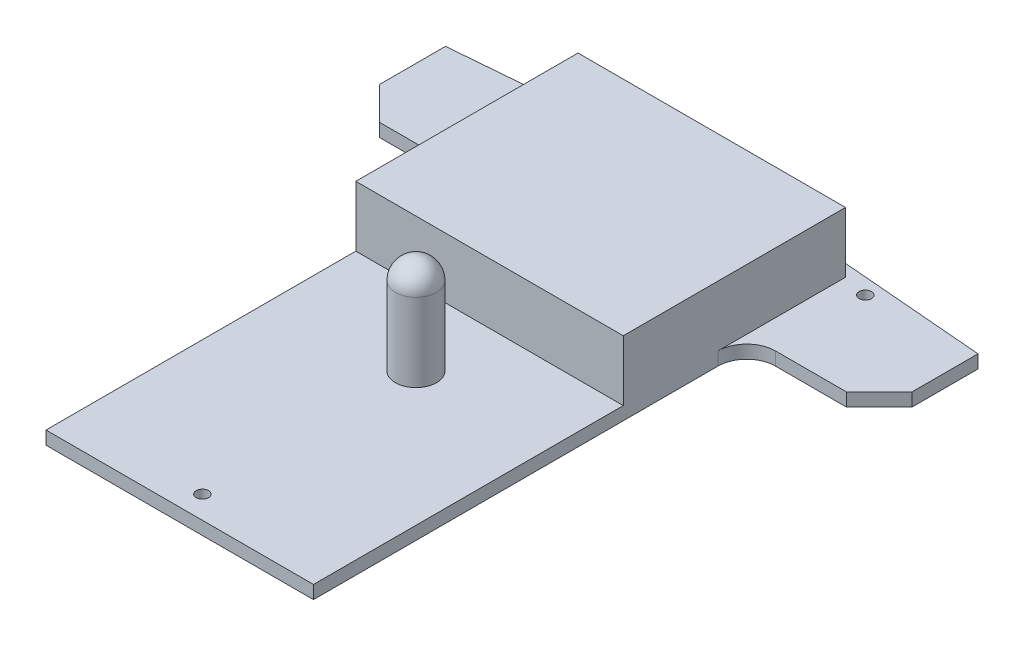
ISO-10303-21;
HEADER;
FILE_DESCRIPTION(('STEP AP214'),'2;1');
FILE_NAME('part.step','',(''),(''),'','','');
FILE_SCHEMA(('AUTOMOTIVE_DESIGN { 1 0 10303 214 1 1 1 1 }'));
ENDSEC;
DATA;
#1=APPLICATION_CONTEXT('core data for automotive mechanical design processes');
#2=APPLICATION_PROTOCOL_DEFINITION('international standard','automotive_design',2000,#1);
#3=PRODUCT_CONTEXT('',#1,'mechanical');
#4=PRODUCT('Part','Part','',(#3));
#5=PRODUCT_RELATED_PRODUCT_CATEGORY('part','',(#4));
#6=PRODUCT_DEFINITION_FORMATION('','',#4);
#7=PRODUCT_DEFINITION_CONTEXT('part definition',#1,'design');
#8=PRODUCT_DEFINITION('design','',#6,#7);
#9=PRODUCT_DEFINITION_SHAPE('','',#8);
#10=(LENGTH_UNIT() NAMED_UNIT(*) SI_UNIT(.MILLI.,.METRE.));
#11=(NAMED_UNIT(*) PLANE_ANGLE_UNIT() SI_UNIT($,.RADIAN.));
#12=(NAMED_UNIT(*) SI_UNIT($,.STERADIAN.) SOLID_ANGLE_UNIT());
#13=UNCERTAINTY_MEASURE_WITH_UNIT(LENGTH_MEASURE(1.E-05),#10,'distance_accuracy_value','');
#14=(GEOMETRIC_REPRESENTATION_CONTEXT(3) GLOBAL_UNCERTAINTY_ASSIGNED_CONTEXT((#13)) GLOBAL_UNIT_ASSIGNED_CONTEXT((#10,
#11,#12)) REPRESENTATION_CONTEXT('',''));
#15=CARTESIAN_POINT('',(0.,0.,0.));
#16=DIRECTION('',(0.,0.,1.));
#17=DIRECTION('',(1.,0.,0.));
#18=AXIS2_PLACEMENT_3D('',#15,#16,#17);
#19=CARTESIAN_POINT('',(19.75,1.6,-49.14));
#20=DIRECTION('',(0.,-1.,0.));
#21=DIRECTION('',(0.,0.,-1.));
#22=AXIS2_PLACEMENT_3D('',#19,#20,#21);
#23=PLANE('',#22);
#24=CARTESIAN_POINT('',(-19.33,1.6,-63.9689341239261));
#25=DIRECTION('',(0.,1.,0.));
#26=DIRECTION('',(0.,0.,1.));
#27=AXIS2_PLACEMENT_3D('',#24,#25,#26);
#28=CIRCLE('',#27,0.750000000000002);
#29=CARTESIAN_POINT('',(-19.33,1.6,-63.2189341239261));
#30=VERTEX_POINT('',#29);
#31=EDGE_CURVE('E226',#30,#30,#28,.T.);
#32=ORIENTED_EDGE('',*,*,#31,.F.);
#33=EDGE_LOOP('',(#32));
#34=FACE_BOUND('',#33,.T.);
#35=CARTESIAN_POINT('',(-19.75,1.6,-49.14));
#36=DIRECTION('',(0.,-1.,0.));
#37=DIRECTION('',(0.,0.,1.));
#38=AXIS2_PLACEMENT_3D('',#35,#36,#37);
#39=CIRCLE('',#38,3.5);
#40=CARTESIAN_POINT('',(-19.75,1.6,-52.64));
#41=VERTEX_POINT('',#40);
#42=CARTESIAN_POINT('',(-16.25,1.6,-49.14));
#43=VERTEX_POINT('',#42);
#44=EDGE_CURVE('E262',#41,#43,#39,.T.);
#45=ORIENTED_EDGE('',*,*,#44,.T.);
#46=DIRECTION('',(0.,0.,-1.));
#47=VECTOR('',#46,1.);
#48=CARTESIAN_POINT('',(-16.25,1.6,-37.64));
#49=LINE('',#48,#47);
#50=CARTESIAN_POINT('',(-16.25,1.6,-64.64));
#51=VERTEX_POINT('',#50);
#52=EDGE_CURVE('E55',#43,#51,#49,.T.);
#53=ORIENTED_EDGE('',*,*,#52,.T.);
#54=DIRECTION('',(1.,0.,0.));
#55=VECTOR('',#54,1.);
#56=CARTESIAN_POINT('',(-16.25,1.6,-64.64));
#57=LINE('',#56,#55);
#58=CARTESIAN_POINT('',(-8.35,1.6,-64.64));
#59=VERTEX_POINT('',#58);
#60=EDGE_CURVE('E183',#51,#59,#57,.T.);
#61=ORIENTED_EDGE('',*,*,#60,.T.);
#62=DIRECTION('',(0.,0.,-1.));
#63=VECTOR('',#62,1.);
#64=CARTESIAN_POINT('',(-8.35,1.6,-64.64));
#65=LINE('',#64,#63);
#66=CARTESIAN_POINT('',(-8.35,1.6,-66.64));
#67=VERTEX_POINT('',#66);
#68=EDGE_CURVE('E252',#59,#67,#65,.T.);
#69=ORIENTED_EDGE('',*,*,#68,.T.);
#70=DIRECTION('',(-0.99654575824488,0.,0.0830454798537411));
#71=VECTOR('',#70,1.);
#72=CARTESIAN_POINT('',(-8.35,1.6,-66.64));
#73=LINE('',#72,#71);
#74=CARTESIAN_POINT('',(-32.35,1.6,-64.64));
#75=VERTEX_POINT('',#74);
#76=EDGE_CURVE('E254',#67,#75,#73,.T.);
#77=ORIENTED_EDGE('',*,*,#76,.T.);
#78=DIRECTION('',(0.,0.,1.));
#79=VECTOR('',#78,1.);
#80=CARTESIAN_POINT('',(-32.35,1.6,-56.64));
#81=LINE('',#80,#79);
#82=CARTESIAN_POINT('',(-32.35,1.6,-56.64));
#83=VERTEX_POINT('',#82);
#84=EDGE_CURVE('E256',#75,#83,#81,.T.);
#85=ORIENTED_EDGE('',*,*,#84,.T.);
#86=DIRECTION('',(0.70710678118655,0.,0.707106781186545));
#87=VECTOR('',#86,1.);
#88=CARTESIAN_POINT('',(-28.35,1.6,-52.64));
#89=LINE('',#88,#87);
#90=CARTESIAN_POINT('',(-28.35,1.6,-52.64));
#91=VERTEX_POINT('',#90);
#92=EDGE_CURVE('E258',#83,#91,#89,.T.);
#93=ORIENTED_EDGE('',*,*,#92,.T.);
#94=DIRECTION('',(1.,0.,0.));
#95=VECTOR('',#94,1.);
#96=CARTESIAN_POINT('',(-19.75,1.6,-52.64));
#97=LINE('',#96,#95);
#98=EDGE_CURVE('E260',#91,#41,#97,.T.);
#99=ORIENTED_EDGE('',*,*,#98,.T.);
#100=EDGE_LOOP('',(#45,#53,#61,#69,#77,#85,#93,#99));
#101=FACE_BOUND('',#100,.T.);
#102=ADVANCED_FACE('F40',(#34,#101),#23,.F.);
#103=CARTESIAN_POINT('',(0.,1.6,-28.7));
#104=DIRECTION('',(0.,-1.,0.));
#105=DIRECTION('',(0.,0.,-1.));
#106=AXIS2_PLACEMENT_3D('',#103,#104,#105);
#107=CIRCLE('',#106,2.5);
#108=CARTESIAN_POINT('',(0.,1.6,-31.2));
#109=VERTEX_POINT('',#108);
#110=EDGE_CURVE('E48',#109,#109,#107,.F.);
#111=ORIENTED_EDGE('',*,*,#110,.F.);
#112=EDGE_LOOP('',(#111));
#113=FACE_BOUND('',#112,.T.);
#114=CARTESIAN_POINT('',(0.,1.6,-2.75));
#115=DIRECTION('',(0.,1.,0.));
#116=DIRECTION('',(0.,0.,1.));
#117=AXIS2_PLACEMENT_3D('',#114,#115,#116);
#118=CIRCLE('',#117,0.75);
#119=CARTESIAN_POINT('',(0.,1.6,-2.));
#120=VERTEX_POINT('',#119);
#121=EDGE_CURVE('E220',#120,#120,#118,.T.);
#122=ORIENTED_EDGE('',*,*,#121,.F.);
#123=EDGE_LOOP('',(#122));
#124=FACE_BOUND('',#123,.T.);
#125=DIRECTION('',(1.,0.,0.));
#126=VECTOR('',#125,1.);
#127=CARTESIAN_POINT('',(-16.25,1.6,-37.64));
#128=LINE('',#127,#126);
#129=CARTESIAN_POINT('',(-16.25,1.6,-37.64));
#130=VERTEX_POINT('',#129);
#131=CARTESIAN_POINT('',(16.25,1.6,-37.64));
#132=VERTEX_POINT('',#131);
#133=EDGE_CURVE('E202',#130,#132,#128,.T.);
#134=ORIENTED_EDGE('',*,*,#133,.F.);
#135=DIRECTION('',(0.,0.,1.));
#136=VECTOR('',#135,1.);
#137=CARTESIAN_POINT('',(-16.25,1.6,0.));
#138=LINE('',#137,#136);
#139=CARTESIAN_POINT('',(-16.25,1.6,0.));
#140=VERTEX_POINT('',#139);
#141=EDGE_CURVE('E264',#130,#140,#138,.T.);
#142=ORIENTED_EDGE('',*,*,#141,.T.);
#143=DIRECTION('',(1.,0.,0.));
#144=VECTOR('',#143,1.);
#145=CARTESIAN_POINT('',(-16.25,1.6,0.));
#146=LINE('',#145,#144);
#147=CARTESIAN_POINT('',(16.25,1.6,0.));
#148=VERTEX_POINT('',#147);
#149=EDGE_CURVE('E266',#140,#148,#146,.T.);
#150=ORIENTED_EDGE('',*,*,#149,.T.);
#151=DIRECTION('',(0.,0.,-1.));
#152=VECTOR('',#151,1.);
#153=CARTESIAN_POINT('',(16.25,1.6,0.));
#154=LINE('',#153,#152);
#155=EDGE_CURVE('E268',#148,#132,#154,.T.);
#156=ORIENTED_EDGE('',*,*,#155,.T.);
#157=EDGE_LOOP('',(#134,#142,#150,#156));
#158=FACE_BOUND('',#157,.T.);
#159=ADVANCED_FACE('F352',(#113,#124,#158),#23,.F.);
#160=DIRECTION('',(0.,0.,1.));
#161=VECTOR('',#160,1.);
#162=CARTESIAN_POINT('',(8.35,1.6,-66.64));
#163=LINE('',#162,#161);
#164=CARTESIAN_POINT('',(8.35,1.6,-66.64));
#165=VERTEX_POINT('',#164);
#166=CARTESIAN_POINT('',(8.35,1.6,-64.64));
#167=VERTEX_POINT('',#166);
#168=EDGE_CURVE('E250',#165,#167,#163,.T.);
#169=ORIENTED_EDGE('',*,*,#168,.T.);
#170=CARTESIAN_POINT('',(16.25,1.6,-64.64));
#171=VERTEX_POINT('',#170);
#172=EDGE_CURVE('E63',#167,#171,#57,.T.);
#173=ORIENTED_EDGE('',*,*,#172,.T.);
#174=DIRECTION('',(0.,0.,-1.));
#175=VECTOR('',#174,1.);
#176=CARTESIAN_POINT('',(16.25,1.6,-37.64));
#177=LINE('',#176,#175);
#178=CARTESIAN_POINT('',(16.25,1.6,-49.14));
#179=VERTEX_POINT('',#178);
#180=EDGE_CURVE('E211',#179,#171,#177,.T.);
#181=ORIENTED_EDGE('',*,*,#180,.F.);
#182=CARTESIAN_POINT('',(19.75,1.6,-49.14));
#183=DIRECTION('',(0.,-1.,0.));
#184=DIRECTION('',(0.,0.,-1.));
#185=AXIS2_PLACEMENT_3D('',#182,#183,#184);
#186=CIRCLE('',#185,3.5);
#187=CARTESIAN_POINT('',(19.75,1.6,-52.64));
#188=VERTEX_POINT('',#187);
#189=EDGE_CURVE('E238',#179,#188,#186,.T.);
#190=ORIENTED_EDGE('',*,*,#189,.T.);
#191=DIRECTION('',(1.,0.,0.));
#192=VECTOR('',#191,1.);
#193=CARTESIAN_POINT('',(19.75,1.6,-52.64));
#194=LINE('',#193,#192);
#195=CARTESIAN_POINT('',(28.35,1.6,-52.64));
#196=VERTEX_POINT('',#195);
#197=EDGE_CURVE('E241',#188,#196,#194,.T.);
#198=ORIENTED_EDGE('',*,*,#197,.T.);
#199=DIRECTION('',(0.707106781186545,0.,-0.70710678118655));
#200=VECTOR('',#199,1.);
#201=CARTESIAN_POINT('',(28.35,1.6,-52.64));
#202=LINE('',#201,#200);
#203=CARTESIAN_POINT('',(32.35,1.6,-56.64));
#204=VERTEX_POINT('',#203);
#205=EDGE_CURVE('E244',#196,#204,#202,.T.);
#206=ORIENTED_EDGE('',*,*,#205,.T.);
#207=DIRECTION('',(0.,0.,-1.));
#208=VECTOR('',#207,1.);
#209=CARTESIAN_POINT('',(32.35,1.6,-56.64));
#210=LINE('',#209,#208);
#211=CARTESIAN_POINT('',(32.35,1.6,-64.64));
#212=VERTEX_POINT('',#211);
#213=EDGE_CURVE('E246',#204,#212,#210,.T.);
#214=ORIENTED_EDGE('',*,*,#213,.T.);
#215=DIRECTION('',(-0.99654575824488,0.,-0.08304547985374));
#216=VECTOR('',#215,1.);
#217=CARTESIAN_POINT('',(32.35,1.6,-64.64));
#218=LINE('',#217,#216);
#219=EDGE_CURVE('E248',#212,#165,#218,.T.);
#220=ORIENTED_EDGE('',*,*,#219,.T.);
#221=EDGE_LOOP('',(#169,#173,#181,#190,#198,#206,#214,#220));
#222=FACE_BOUND('',#221,.T.);
#223=CARTESIAN_POINT('',(19.33,1.6,-63.9689341239261));
#224=DIRECTION('',(0.,1.,0.));
#225=DIRECTION('',(0.,0.,1.));
#226=AXIS2_PLACEMENT_3D('',#223,#224,#225);
#227=CIRCLE('',#226,0.750000000000002);
#228=CARTESIAN_POINT('',(19.33,1.6,-63.2189341239261));
#229=VERTEX_POINT('',#228);
#230=EDGE_CURVE('E232',#229,#229,#227,.T.);
#231=ORIENTED_EDGE('',*,*,#230,.F.);
#232=EDGE_LOOP('',(#231));
#233=FACE_BOUND('',#232,.T.);
#234=ADVANCED_FACE('F355',(#222,#233),#23,.F.);
#235=CARTESIAN_POINT('',(19.75,0.,-49.14));
#236=DIRECTION('',(0.,-1.,0.));
#237=DIRECTION('',(0.,0.,-1.));
#238=AXIS2_PLACEMENT_3D('',#235,#236,#237);
#239=PLANE('',#238);
#240=CARTESIAN_POINT('',(-19.33,0.,-63.9689341239261));
#241=DIRECTION('',(0.,1.,0.));
#242=DIRECTION('',(0.,0.,1.));
#243=AXIS2_PLACEMENT_3D('',#240,#241,#242);
#244=CIRCLE('',#243,0.750000000000002);
#245=CARTESIAN_POINT('',(-19.33,0.,-63.2189341239261));
#246=VERTEX_POINT('',#245);
#247=EDGE_CURVE('E223',#246,#246,#244,.T.);
#248=ORIENTED_EDGE('',*,*,#247,.T.);
#249=EDGE_LOOP('',(#248));
#250=FACE_BOUND('',#249,.T.);
#251=CARTESIAN_POINT('',(19.75,0.,-49.14));
#252=DIRECTION('',(0.,-1.,0.));
#253=DIRECTION('',(0.,0.,-1.));
#254=AXIS2_PLACEMENT_3D('',#251,#252,#253);
#255=CIRCLE('',#254,3.5);
#256=CARTESIAN_POINT('',(16.25,0.,-49.14));
#257=VERTEX_POINT('',#256);
#258=CARTESIAN_POINT('',(19.75,0.,-52.64));
#259=VERTEX_POINT('',#258);
#260=EDGE_CURVE('E235',#257,#259,#255,.T.);
#261=ORIENTED_EDGE('',*,*,#260,.F.);
#262=DIRECTION('',(0.,0.,-1.));
#263=VECTOR('',#262,1.);
#264=CARTESIAN_POINT('',(16.25,0.,0.));
#265=LINE('',#264,#263);
#266=CARTESIAN_POINT('',(16.25,0.,0.));
#267=VERTEX_POINT('',#266);
#268=EDGE_CURVE('E242',#267,#257,#265,.T.);
#269=ORIENTED_EDGE('',*,*,#268,.F.);
#270=DIRECTION('',(1.,0.,0.));
#271=VECTOR('',#270,1.);
#272=CARTESIAN_POINT('',(-16.25,0.,0.));
#273=LINE('',#272,#271);
#274=CARTESIAN_POINT('',(-16.25,0.,0.));
#275=VERTEX_POINT('',#274);
#276=EDGE_CURVE('E299',#275,#267,#273,.T.);
#277=ORIENTED_EDGE('',*,*,#276,.F.);
#278=DIRECTION('',(0.,0.,1.));
#279=VECTOR('',#278,1.);
#280=CARTESIAN_POINT('',(-16.25,0.,0.));
#281=LINE('',#280,#279);
#282=CARTESIAN_POINT('',(-16.25,0.,-49.14));
#283=VERTEX_POINT('',#282);
#284=EDGE_CURVE('E297',#283,#275,#281,.T.);
#285=ORIENTED_EDGE('',*,*,#284,.F.);
#286=CARTESIAN_POINT('',(-19.75,0.,-49.14));
#287=DIRECTION('',(0.,-1.,0.));
#288=DIRECTION('',(0.,0.,1.));
#289=AXIS2_PLACEMENT_3D('',#286,#287,#288);
#290=CIRCLE('',#289,3.5);
#291=CARTESIAN_POINT('',(-19.75,0.,-52.64));
#292=VERTEX_POINT('',#291);
#293=EDGE_CURVE('E295',#292,#283,#290,.T.);
#294=ORIENTED_EDGE('',*,*,#293,.F.);
#295=DIRECTION('',(1.,0.,0.));
#296=VECTOR('',#295,1.);
#297=CARTESIAN_POINT('',(-19.75,0.,-52.64));
#298=LINE('',#297,#296);
#299=CARTESIAN_POINT('',(-28.35,0.,-52.64));
#300=VERTEX_POINT('',#299);
#301=EDGE_CURVE('E293',#300,#292,#298,.T.);
#302=ORIENTED_EDGE('',*,*,#301,.F.);
#303=DIRECTION('',(0.70710678118655,0.,0.707106781186545));
#304=VECTOR('',#303,1.);
#305=CARTESIAN_POINT('',(-28.35,0.,-52.64));
#306=LINE('',#305,#304);
#307=CARTESIAN_POINT('',(-32.35,0.,-56.64));
#308=VERTEX_POINT('',#307);
#309=EDGE_CURVE('E291',#308,#300,#306,.T.);
#310=ORIENTED_EDGE('',*,*,#309,.F.);
#311=DIRECTION('',(0.,0.,1.));
#312=VECTOR('',#311,1.);
#313=CARTESIAN_POINT('',(-32.35,0.,-56.64));
#314=LINE('',#313,#312);
#315=CARTESIAN_POINT('',(-32.35,0.,-64.64));
#316=VERTEX_POINT('',#315);
#317=EDGE_CURVE('E289',#316,#308,#314,.T.);
#318=ORIENTED_EDGE('',*,*,#317,.F.);
#319=DIRECTION('',(-0.99654575824488,0.,0.0830454798537411));
#320=VECTOR('',#319,1.);
#321=CARTESIAN_POINT('',(-8.35,0.,-66.64));
#322=LINE('',#321,#320);
#323=CARTESIAN_POINT('',(-8.35,0.,-66.64));
#324=VERTEX_POINT('',#323);
#325=EDGE_CURVE('E287',#324,#316,#322,.T.);
#326=ORIENTED_EDGE('',*,*,#325,.F.);
#327=DIRECTION('',(0.,0.,-1.));
#328=VECTOR('',#327,1.);
#329=CARTESIAN_POINT('',(-8.35,0.,-64.64));
#330=LINE('',#329,#328);
#331=CARTESIAN_POINT('',(-8.35,0.,-64.64));
#332=VERTEX_POINT('',#331);
#333=EDGE_CURVE('E285',#332,#324,#330,.T.);
#334=ORIENTED_EDGE('',*,*,#333,.F.);
#335=DIRECTION('',(-1.,0.,0.));
#336=VECTOR('',#335,1.);
#337=CARTESIAN_POINT('',(8.35,0.,-64.64));
#338=LINE('',#337,#336);
#339=CARTESIAN_POINT('',(8.35,0.,-64.64));
#340=VERTEX_POINT('',#339);
#341=EDGE_CURVE('E283',#340,#332,#338,.T.);
#342=ORIENTED_EDGE('',*,*,#341,.F.);
#343=DIRECTION('',(0.,0.,1.));
#344=VECTOR('',#343,1.);
#345=CARTESIAN_POINT('',(8.35,0.,-66.64));
#346=LINE('',#345,#344);
#347=CARTESIAN_POINT('',(8.35,0.,-66.64));
#348=VERTEX_POINT('',#347);
#349=EDGE_CURVE('E281',#348,#340,#346,.T.);
#350=ORIENTED_EDGE('',*,*,#349,.F.);
#351=DIRECTION('',(-0.99654575824488,0.,-0.08304547985374));
#352=VECTOR('',#351,1.);
#353=CARTESIAN_POINT('',(32.35,0.,-64.64));
#354=LINE('',#353,#352);
#355=CARTESIAN_POINT('',(32.35,0.,-64.64));
#356=VERTEX_POINT('',#355);
#357=EDGE_CURVE('E279',#356,#348,#354,.T.);
#358=ORIENTED_EDGE('',*,*,#357,.F.);
#359=DIRECTION('',(0.,0.,-1.));
#360=VECTOR('',#359,1.);
#361=CARTESIAN_POINT('',(32.35,0.,-56.64));
#362=LINE('',#361,#360);
#363=CARTESIAN_POINT('',(32.35,0.,-56.64));
#364=VERTEX_POINT('',#363);
#365=EDGE_CURVE('E277',#364,#356,#362,.T.);
#366=ORIENTED_EDGE('',*,*,#365,.F.);
#367=DIRECTION('',(0.707106781186545,0.,-0.70710678118655));
#368=VECTOR('',#367,1.);
#369=CARTESIAN_POINT('',(28.35,0.,-52.64));
#370=LINE('',#369,#368);
#371=CARTESIAN_POINT('',(28.35,0.,-52.64));
#372=VERTEX_POINT('',#371);
#373=EDGE_CURVE('E275',#372,#364,#370,.T.);
#374=ORIENTED_EDGE('',*,*,#373,.F.);
#375=DIRECTION('',(1.,0.,0.));
#376=VECTOR('',#375,1.);
#377=CARTESIAN_POINT('',(19.75,0.,-52.64));
#378=LINE('',#377,#376);
#379=EDGE_CURVE('E273',#259,#372,#378,.T.);
#380=ORIENTED_EDGE('',*,*,#379,.F.);
#381=EDGE_LOOP('',(#261,#269,#277,#285,#294,#302,#310,#318,#326,#334,#342,#350,#358,#366,#374,#380));
#382=FACE_BOUND('',#381,.T.);
#383=CARTESIAN_POINT('',(19.33,0.,-63.9689341239261));
#384=DIRECTION('',(0.,1.,0.));
#385=DIRECTION('',(0.,0.,1.));
#386=AXIS2_PLACEMENT_3D('',#383,#384,#385);
#387=CIRCLE('',#386,0.750000000000002);
#388=CARTESIAN_POINT('',(19.33,0.,-63.2189341239261));
#389=VERTEX_POINT('',#388);
#390=EDGE_CURVE('E229',#389,#389,#387,.T.);
#391=ORIENTED_EDGE('',*,*,#390,.T.);
#392=EDGE_LOOP('',(#391));
#393=FACE_BOUND('',#392,.T.);
#394=CARTESIAN_POINT('',(0.,0.,-2.75));
#395=DIRECTION('',(0.,1.,0.));
#396=DIRECTION('',(0.,0.,1.));
#397=AXIS2_PLACEMENT_3D('',#394,#395,#396);
#398=CIRCLE('',#397,0.75);
#399=CARTESIAN_POINT('',(0.,0.,-2.));
#400=VERTEX_POINT('',#399);
#401=EDGE_CURVE('E215',#400,#400,#398,.T.);
#402=ORIENTED_EDGE('',*,*,#401,.T.);
#403=EDGE_LOOP('',(#402));
#404=FACE_BOUND('',#403,.T.);
#405=ADVANCED_FACE('F376',(#250,#382,#393,#404),#239,.T.);
#406=CARTESIAN_POINT('',(19.75,1.6,-49.14));
#407=DIRECTION('',(0.,-1.,0.));
#408=DIRECTION('',(0.,0.,-1.));
#409=AXIS2_PLACEMENT_3D('',#406,#407,#408);
#410=CYLINDRICAL_SURFACE('',#409,3.5);
#411=ORIENTED_EDGE('',*,*,#260,.T.);
#412=DIRECTION('',(0.,-1.,0.));
#413=VECTOR('',#412,1.);
#414=CARTESIAN_POINT('',(19.75,1.6,-52.64));
#415=LINE('',#414,#413);
#416=EDGE_CURVE('E212',#188,#259,#415,.T.);
#417=ORIENTED_EDGE('',*,*,#416,.F.);
#418=ORIENTED_EDGE('',*,*,#189,.F.);
#419=DIRECTION('',(0.,-1.,0.));
#420=VECTOR('',#419,1.);
#421=CARTESIAN_POINT('',(16.25,1.6,-49.14));
#422=LINE('',#421,#420);
#423=EDGE_CURVE('E270',#179,#257,#422,.T.);
#424=ORIENTED_EDGE('',*,*,#423,.T.);
#425=EDGE_LOOP('',(#411,#417,#418,#424));
#426=FACE_BOUND('',#425,.T.);
#427=ADVANCED_FACE('F416',(#426),#410,.F.);
#428=CARTESIAN_POINT('',(19.75,1.6,-52.64));
#429=DIRECTION('',(0.,0.,-1.));
#430=DIRECTION('',(-1.,0.,0.));
#431=AXIS2_PLACEMENT_3D('',#428,#429,#430);
#432=PLANE('',#431);
#433=ORIENTED_EDGE('',*,*,#379,.T.);
#434=DIRECTION('',(0.,-1.,0.));
#435=VECTOR('',#434,1.);
#436=CARTESIAN_POINT('',(28.35,1.6,-52.64));
#437=LINE('',#436,#435);
#438=EDGE_CURVE('E343',#196,#372,#437,.T.);
#439=ORIENTED_EDGE('',*,*,#438,.F.);
#440=ORIENTED_EDGE('',*,*,#197,.F.);
#441=ORIENTED_EDGE('',*,*,#416,.T.);
#442=EDGE_LOOP('',(#433,#439,#440,#441));
#443=FACE_BOUND('',#442,.T.);
#444=ADVANCED_FACE('F422',(#443),#432,.F.);
#445=CARTESIAN_POINT('',(28.35,1.6,-52.64));
#446=DIRECTION('',(-0.70710678118655,0.,-0.707106781186545));
#447=DIRECTION('',(-0.707106781186545,0.,0.70710678118655));
#448=AXIS2_PLACEMENT_3D('',#445,#446,#447);
#449=PLANE('',#448);
#450=ORIENTED_EDGE('',*,*,#373,.T.);
#451=DIRECTION('',(0.,-1.,0.));
#452=VECTOR('',#451,1.);
#453=CARTESIAN_POINT('',(32.35,1.6,-56.64));
#454=LINE('',#453,#452);
#455=EDGE_CURVE('E340',#204,#364,#454,.T.);
#456=ORIENTED_EDGE('',*,*,#455,.F.);
#457=ORIENTED_EDGE('',*,*,#205,.F.);
#458=ORIENTED_EDGE('',*,*,#438,.T.);
#459=EDGE_LOOP('',(#450,#456,#457,#458));
#460=FACE_BOUND('',#459,.T.);
#461=ADVANCED_FACE('F487',(#460),#449,.F.);
#462=CARTESIAN_POINT('',(32.35,1.6,-56.64));
#463=DIRECTION('',(-1.,0.,0.));
#464=DIRECTION('',(0.,0.,1.));
#465=AXIS2_PLACEMENT_3D('',#462,#463,#464);
#466=PLANE('',#465);
#467=ORIENTED_EDGE('',*,*,#365,.T.);
#468=DIRECTION('',(0.,-1.,0.));
#469=VECTOR('',#468,1.);
#470=CARTESIAN_POINT('',(32.35,1.6,-64.64));
#471=LINE('',#470,#469);
#472=EDGE_CURVE('E337',#212,#356,#471,.T.);
#473=ORIENTED_EDGE('',*,*,#472,.F.);
#474=ORIENTED_EDGE('',*,*,#213,.F.);
#475=ORIENTED_EDGE('',*,*,#455,.T.);
#476=EDGE_LOOP('',(#467,#473,#474,#475));
#477=FACE_BOUND('',#476,.T.);
#478=ADVANCED_FACE('F483',(#477),#466,.F.);
#479=CARTESIAN_POINT('',(32.35,1.6,-64.64));
#480=DIRECTION('',(-0.0830454798537401,0.,0.99654575824488));
#481=DIRECTION('',(0.99654575824488,0.,0.0830454798537401));
#482=AXIS2_PLACEMENT_3D('',#479,#480,#481);
#483=PLANE('',#482);
#484=ORIENTED_EDGE('',*,*,#357,.T.);
#485=DIRECTION('',(0.,-1.,0.));
#486=VECTOR('',#485,1.);
#487=CARTESIAN_POINT('',(8.35,1.6,-66.64));
#488=LINE('',#487,#486);
#489=EDGE_CURVE('E334',#165,#348,#488,.T.);
#490=ORIENTED_EDGE('',*,*,#489,.F.);
#491=ORIENTED_EDGE('',*,*,#219,.F.);
#492=ORIENTED_EDGE('',*,*,#472,.T.);
#493=EDGE_LOOP('',(#484,#490,#491,#492));
#494=FACE_BOUND('',#493,.T.);
#495=ADVANCED_FACE('F480',(#494),#483,.F.);
#496=CARTESIAN_POINT('',(8.35,1.6,-66.64));
#497=DIRECTION('',(1.,0.,0.));
#498=DIRECTION('',(0.,0.,-1.));
#499=AXIS2_PLACEMENT_3D('',#496,#497,#498);
#500=PLANE('',#499);
#501=ORIENTED_EDGE('',*,*,#349,.T.);
#502=DIRECTION('',(0.,-1.,0.));
#503=VECTOR('',#502,1.);
#504=CARTESIAN_POINT('',(8.35,1.6,-64.64));
#505=LINE('',#504,#503);
#506=EDGE_CURVE('E331',#167,#340,#505,.T.);
#507=ORIENTED_EDGE('',*,*,#506,.F.);
#508=ORIENTED_EDGE('',*,*,#168,.F.);
#509=ORIENTED_EDGE('',*,*,#489,.T.);
#510=EDGE_LOOP('',(#501,#507,#508,#509));
#511=FACE_BOUND('',#510,.T.);
#512=ADVANCED_FACE('F477',(#511),#500,.F.);
#513=CARTESIAN_POINT('',(8.35,1.6,-64.64));
#514=DIRECTION('',(0.,0.,1.));
#515=DIRECTION('',(1.,0.,0.));
#516=AXIS2_PLACEMENT_3D('',#513,#514,#515);
#517=PLANE('',#516);
#518=ORIENTED_EDGE('',*,*,#341,.T.);
#519=DIRECTION('',(0.,-1.,0.));
#520=VECTOR('',#519,1.);
#521=CARTESIAN_POINT('',(-8.35,1.6,-64.64));
#522=LINE('',#521,#520);
#523=EDGE_CURVE('E328',#59,#332,#522,.T.);
#524=ORIENTED_EDGE('',*,*,#523,.F.);
#525=ORIENTED_EDGE('',*,*,#60,.F.);
#526=DIRECTION('',(0.,-1.,0.));
#527=VECTOR('',#526,1.);
#528=CARTESIAN_POINT('',(-16.25,8.95,-64.64));
#529=LINE('',#528,#527);
#530=CARTESIAN_POINT('',(-16.25,8.95,-64.64));
#531=VERTEX_POINT('',#530);
#532=EDGE_CURVE('E177',#531,#51,#529,.T.);
#533=ORIENTED_EDGE('',*,*,#532,.F.);
#534=DIRECTION('',(1.,0.,0.));
#535=VECTOR('',#534,1.);
#536=CARTESIAN_POINT('',(-16.25,8.95,-64.64));
#537=LINE('',#536,#535);
#538=CARTESIAN_POINT('',(16.25,8.95,-64.64));
#539=VERTEX_POINT('',#538);
#540=EDGE_CURVE('E181',#531,#539,#537,.T.);
#541=ORIENTED_EDGE('',*,*,#540,.T.);
#542=DIRECTION('',(0.,-1.,0.));
#543=VECTOR('',#542,1.);
#544=CARTESIAN_POINT('',(16.25,8.95,-64.64));
#545=LINE('',#544,#543);
#546=EDGE_CURVE('E186',#539,#171,#545,.T.);
#547=ORIENTED_EDGE('',*,*,#546,.T.);
#548=ORIENTED_EDGE('',*,*,#172,.F.);
#549=ORIENTED_EDGE('',*,*,#506,.T.);
#550=EDGE_LOOP('',(#518,#524,#525,#533,#541,#547,#548,#549));
#551=FACE_BOUND('',#550,.T.);
#552=ADVANCED_FACE('F179',(#551),#517,.F.);
#553=CARTESIAN_POINT('',(-8.35,1.6,-64.64));
#554=DIRECTION('',(-1.,0.,0.));
#555=DIRECTION('',(0.,0.,1.));
#556=AXIS2_PLACEMENT_3D('',#553,#554,#555);
#557=PLANE('',#556);
#558=ORIENTED_EDGE('',*,*,#333,.T.);
#559=DIRECTION('',(0.,-1.,0.));
#560=VECTOR('',#559,1.);
#561=CARTESIAN_POINT('',(-8.35,1.6,-66.64));
#562=LINE('',#561,#560);
#563=EDGE_CURVE('E325',#67,#324,#562,.T.);
#564=ORIENTED_EDGE('',*,*,#563,.F.);
#565=ORIENTED_EDGE('',*,*,#68,.F.);
#566=ORIENTED_EDGE('',*,*,#523,.T.);
#567=EDGE_LOOP('',(#558,#564,#565,#566));
#568=FACE_BOUND('',#567,.T.);
#569=ADVANCED_FACE('F383',(#568),#557,.F.);
#570=CARTESIAN_POINT('',(-8.35,1.6,-66.64));
#571=DIRECTION('',(0.083045479853741,0.,0.996545758244879));
#572=DIRECTION('',(0.99654575824488,0.,-0.0830454798537411));
#573=AXIS2_PLACEMENT_3D('',#570,#571,#572);
#574=PLANE('',#573);
#575=ORIENTED_EDGE('',*,*,#325,.T.);
#576=DIRECTION('',(0.,-1.,0.));
#577=VECTOR('',#576,1.);
#578=CARTESIAN_POINT('',(-32.35,1.6,-64.64));
#579=LINE('',#578,#577);
#580=EDGE_CURVE('E322',#75,#316,#579,.T.);
#581=ORIENTED_EDGE('',*,*,#580,.F.);
#582=ORIENTED_EDGE('',*,*,#76,.F.);
#583=ORIENTED_EDGE('',*,*,#563,.T.);
#584=EDGE_LOOP('',(#575,#581,#582,#583));
#585=FACE_BOUND('',#584,.T.);
#586=ADVANCED_FACE('F387',(#585),#574,.F.);
#587=CARTESIAN_POINT('',(-32.35,1.6,-56.64));
#588=DIRECTION('',(1.,0.,0.));
#589=DIRECTION('',(0.,0.,-1.));
#590=AXIS2_PLACEMENT_3D('',#587,#588,#589);
#591=PLANE('',#590);
#592=ORIENTED_EDGE('',*,*,#317,.T.);
#593=DIRECTION('',(0.,-1.,0.));
#594=VECTOR('',#593,1.);
#595=CARTESIAN_POINT('',(-32.35,1.6,-56.64));
#596=LINE('',#595,#594);
#597=EDGE_CURVE('E319',#83,#308,#596,.T.);
#598=ORIENTED_EDGE('',*,*,#597,.F.);
#599=ORIENTED_EDGE('',*,*,#84,.F.);
#600=ORIENTED_EDGE('',*,*,#580,.T.);
#601=EDGE_LOOP('',(#592,#598,#599,#600));
#602=FACE_BOUND('',#601,.T.);
#603=ADVANCED_FACE('F394',(#602),#591,.F.);
#604=CARTESIAN_POINT('',(-28.35,1.6,-52.64));
#605=DIRECTION('',(0.707106781186545,0.,-0.70710678118655));
#606=DIRECTION('',(-0.70710678118655,0.,-0.707106781186545));
#607=AXIS2_PLACEMENT_3D('',#604,#605,#606);
#608=PLANE('',#607);
#609=ORIENTED_EDGE('',*,*,#309,.T.);
#610=DIRECTION('',(0.,-1.,0.));
#611=VECTOR('',#610,1.);
#612=CARTESIAN_POINT('',(-28.35,1.6,-52.64));
#613=LINE('',#612,#611);
#614=EDGE_CURVE('E316',#91,#300,#613,.T.);
#615=ORIENTED_EDGE('',*,*,#614,.F.);
#616=ORIENTED_EDGE('',*,*,#92,.F.);
#617=ORIENTED_EDGE('',*,*,#597,.T.);
#618=EDGE_LOOP('',(#609,#615,#616,#617));
#619=FACE_BOUND('',#618,.T.);
#620=ADVANCED_FACE('F397',(#619),#608,.F.);
#621=CARTESIAN_POINT('',(-19.75,1.6,-52.64));
#622=DIRECTION('',(0.,0.,-1.));
#623=DIRECTION('',(-1.,0.,0.));
#624=AXIS2_PLACEMENT_3D('',#621,#622,#623);
#625=PLANE('',#624);
#626=ORIENTED_EDGE('',*,*,#301,.T.);
#627=DIRECTION('',(0.,-1.,0.));
#628=VECTOR('',#627,1.);
#629=CARTESIAN_POINT('',(-19.75,1.6,-52.64));
#630=LINE('',#629,#628);
#631=EDGE_CURVE('E313',#41,#292,#630,.T.);
#632=ORIENTED_EDGE('',*,*,#631,.F.);
#633=ORIENTED_EDGE('',*,*,#98,.F.);
#634=ORIENTED_EDGE('',*,*,#614,.T.);
#635=EDGE_LOOP('',(#626,#632,#633,#634));
#636=FACE_BOUND('',#635,.T.);
#637=ADVANCED_FACE('F402',(#636),#625,.F.);
#638=CARTESIAN_POINT('',(-19.75,1.6,-49.14));
#639=DIRECTION('',(0.,-1.,0.));
#640=DIRECTION('',(0.,0.,-1.));
#641=AXIS2_PLACEMENT_3D('',#638,#639,#640);
#642=CYLINDRICAL_SURFACE('',#641,3.5);
#643=ORIENTED_EDGE('',*,*,#293,.T.);
#644=DIRECTION('',(0.,-1.,0.));
#645=VECTOR('',#644,1.);
#646=CARTESIAN_POINT('',(-16.25,1.6,-49.14));
#647=LINE('',#646,#645);
#648=EDGE_CURVE('E310',#43,#283,#647,.T.);
#649=ORIENTED_EDGE('',*,*,#648,.F.);
#650=ORIENTED_EDGE('',*,*,#44,.F.);
#651=ORIENTED_EDGE('',*,*,#631,.T.);
#652=EDGE_LOOP('',(#643,#649,#650,#651));
#653=FACE_BOUND('',#652,.T.);
#654=ADVANCED_FACE('F406',(#653),#642,.F.);
#655=CARTESIAN_POINT('',(-16.25,1.6,0.));
#656=DIRECTION('',(1.,0.,0.));
#657=DIRECTION('',(0.,0.,-1.));
#658=AXIS2_PLACEMENT_3D('',#655,#656,#657);
#659=PLANE('',#658);
#660=ORIENTED_EDGE('',*,*,#284,.T.);
#661=DIRECTION('',(0.,-1.,0.));
#662=VECTOR('',#661,1.);
#663=CARTESIAN_POINT('',(-16.25,1.6,0.));
#664=LINE('',#663,#662);
#665=EDGE_CURVE('E307',#140,#275,#664,.T.);
#666=ORIENTED_EDGE('',*,*,#665,.F.);
#667=ORIENTED_EDGE('',*,*,#141,.F.);
#668=DIRECTION('',(0.,-1.,0.));
#669=VECTOR('',#668,1.);
#670=CARTESIAN_POINT('',(-16.25,8.95,-37.64));
#671=LINE('',#670,#669);
#672=CARTESIAN_POINT('',(-16.25,8.95,-37.64));
#673=VERTEX_POINT('',#672);
#674=EDGE_CURVE('E200',#673,#130,#671,.T.);
#675=ORIENTED_EDGE('',*,*,#674,.F.);
#676=DIRECTION('',(0.,0.,-1.));
#677=VECTOR('',#676,1.);
#678=CARTESIAN_POINT('',(-16.25,8.95,-37.64));
#679=LINE('',#678,#677);
#680=EDGE_CURVE('E192',#673,#531,#679,.T.);
#681=ORIENTED_EDGE('',*,*,#680,.T.);
#682=ORIENTED_EDGE('',*,*,#532,.T.);
#683=ORIENTED_EDGE('',*,*,#52,.F.);
#684=ORIENTED_EDGE('',*,*,#648,.T.);
#685=EDGE_LOOP('',(#660,#666,#667,#675,#681,#682,#683,#684));
#686=FACE_BOUND('',#685,.T.);
#687=ADVANCED_FACE('F197',(#686),#659,.F.);
#688=CARTESIAN_POINT('',(-16.25,1.6,0.));
#689=DIRECTION('',(0.,0.,-1.));
#690=DIRECTION('',(-1.,0.,0.));
#691=AXIS2_PLACEMENT_3D('',#688,#689,#690);
#692=PLANE('',#691);
#693=ORIENTED_EDGE('',*,*,#276,.T.);
#694=DIRECTION('',(0.,-1.,0.));
#695=VECTOR('',#694,1.);
#696=CARTESIAN_POINT('',(16.25,1.6,0.));
#697=LINE('',#696,#695);
#698=EDGE_CURVE('E304',#148,#267,#697,.T.);
#699=ORIENTED_EDGE('',*,*,#698,.F.);
#700=ORIENTED_EDGE('',*,*,#149,.F.);
#701=ORIENTED_EDGE('',*,*,#665,.T.);
#702=EDGE_LOOP('',(#693,#699,#700,#701));
#703=FACE_BOUND('',#702,.T.);
#704=ADVANCED_FACE('F413',(#703),#692,.F.);
#705=CARTESIAN_POINT('',(16.25,1.6,0.));
#706=DIRECTION('',(-1.,0.,0.));
#707=DIRECTION('',(0.,0.,1.));
#708=AXIS2_PLACEMENT_3D('',#705,#706,#707);
#709=PLANE('',#708);
#710=ORIENTED_EDGE('',*,*,#268,.T.);
#711=ORIENTED_EDGE('',*,*,#423,.F.);
#712=ORIENTED_EDGE('',*,*,#180,.T.);
#713=ORIENTED_EDGE('',*,*,#546,.F.);
#714=DIRECTION('',(0.,0.,-1.));
#715=VECTOR('',#714,1.);
#716=CARTESIAN_POINT('',(16.25,8.95,-37.64));
#717=LINE('',#716,#715);
#718=CARTESIAN_POINT('',(16.25,8.95,-37.64));
#719=VERTEX_POINT('',#718);
#720=EDGE_CURVE('E194',#719,#539,#717,.T.);
#721=ORIENTED_EDGE('',*,*,#720,.F.);
#722=DIRECTION('',(0.,-1.,0.));
#723=VECTOR('',#722,1.);
#724=CARTESIAN_POINT('',(16.25,8.95,-37.64));
#725=LINE('',#724,#723);
#726=EDGE_CURVE('E216',#719,#132,#725,.T.);
#727=ORIENTED_EDGE('',*,*,#726,.T.);
#728=ORIENTED_EDGE('',*,*,#155,.F.);
#729=ORIENTED_EDGE('',*,*,#698,.T.);
#730=EDGE_LOOP('',(#710,#711,#712,#713,#721,#727,#728,#729));
#731=FACE_BOUND('',#730,.T.);
#732=ADVANCED_FACE('F366',(#731),#709,.F.);
#733=CARTESIAN_POINT('',(19.33,1.6,-63.9689341239261));
#734=DIRECTION('',(0.,-1.,0.));
#735=DIRECTION('',(0.,0.,-1.));
#736=AXIS2_PLACEMENT_3D('',#733,#734,#735);
#737=CYLINDRICAL_SURFACE('',#736,0.750000000000002);
#738=ORIENTED_EDGE('',*,*,#230,.T.);
#739=EDGE_LOOP('',(#738));
#740=FACE_BOUND('',#739,.T.);
#741=ORIENTED_EDGE('',*,*,#390,.F.);
#742=EDGE_LOOP('',(#741));
#743=FACE_BOUND('',#742,.T.);
#744=ADVANCED_FACE('F428',(#740,#743),#737,.F.);
#745=CARTESIAN_POINT('',(-19.33,1.6,-63.9689341239261));
#746=DIRECTION('',(0.,-1.,0.));
#747=DIRECTION('',(0.,0.,-1.));
#748=AXIS2_PLACEMENT_3D('',#745,#746,#747);
#749=CYLINDRICAL_SURFACE('',#748,0.750000000000002);
#750=ORIENTED_EDGE('',*,*,#31,.T.);
#751=EDGE_LOOP('',(#750));
#752=FACE_BOUND('',#751,.T.);
#753=ORIENTED_EDGE('',*,*,#247,.F.);
#754=EDGE_LOOP('',(#753));
#755=FACE_BOUND('',#754,.T.);
#756=ADVANCED_FACE('F431',(#752,#755),#749,.F.);
#757=CARTESIAN_POINT('',(0.,1.6,-2.75));
#758=DIRECTION('',(0.,-1.,0.));
#759=DIRECTION('',(0.,0.,-1.));
#760=AXIS2_PLACEMENT_3D('',#757,#758,#759);
#761=CYLINDRICAL_SURFACE('',#760,0.75);
#762=ORIENTED_EDGE('',*,*,#121,.T.);
#763=EDGE_LOOP('',(#762));
#764=FACE_BOUND('',#763,.T.);
#765=ORIENTED_EDGE('',*,*,#401,.F.);
#766=EDGE_LOOP('',(#765));
#767=FACE_BOUND('',#766,.T.);
#768=ADVANCED_FACE('F440',(#764,#767),#761,.F.);
#769=CARTESIAN_POINT('',(-16.25,8.95,-37.64));
#770=DIRECTION('',(0.,0.,-1.));
#771=DIRECTION('',(-1.,0.,0.));
#772=AXIS2_PLACEMENT_3D('',#769,#770,#771);
#773=PLANE('',#772);
#774=ORIENTED_EDGE('',*,*,#133,.T.);
#775=ORIENTED_EDGE('',*,*,#726,.F.);
#776=DIRECTION('',(1.,0.,0.));
#777=VECTOR('',#776,1.);
#778=CARTESIAN_POINT('',(-16.25,8.95,-37.64));
#779=LINE('',#778,#777);
#780=EDGE_CURVE('E187',#673,#719,#779,.T.);
#781=ORIENTED_EDGE('',*,*,#780,.F.);
#782=ORIENTED_EDGE('',*,*,#674,.T.);
#783=EDGE_LOOP('',(#774,#775,#781,#782));
#784=FACE_BOUND('',#783,.T.);
#785=ADVANCED_FACE('F364',(#784),#773,.F.);
#786=CARTESIAN_POINT('',(0.,8.95,0.));
#787=DIRECTION('',(0.,-1.,0.));
#788=DIRECTION('',(0.,0.,-1.));
#789=AXIS2_PLACEMENT_3D('',#786,#787,#788);
#790=PLANE('',#789);
#791=ORIENTED_EDGE('',*,*,#680,.F.);
#792=ORIENTED_EDGE('',*,*,#780,.T.);
#793=ORIENTED_EDGE('',*,*,#720,.T.);
#794=ORIENTED_EDGE('',*,*,#540,.F.);
#795=EDGE_LOOP('',(#791,#792,#793,#794));
#796=FACE_BOUND('',#795,.T.);
#797=ADVANCED_FACE('F191',(#796),#790,.F.);
#798=CARTESIAN_POINT('',(0.,13.6,-28.7));
#799=DIRECTION('',(0.,-1.,0.));
#800=DIRECTION('',(0.,0.,-1.));
#801=AXIS2_PLACEMENT_3D('',#798,#799,#800);
#802=CYLINDRICAL_SURFACE('',#801,2.5);
#803=CARTESIAN_POINT('',(0.,11.1,-28.7));
#804=DIRECTION('',(0.,-1.,0.));
#805=DIRECTION('',(0.,0.,-1.));
#806=AXIS2_PLACEMENT_3D('',#803,#804,#805);
#807=CIRCLE('',#806,2.5);
#808=CARTESIAN_POINT('',(0.,11.1,-31.2));
#809=VERTEX_POINT('',#808);
#810=EDGE_CURVE('E11',#809,#809,#807,.T.);
#811=ORIENTED_EDGE('',*,*,#810,.T.);
#812=EDGE_LOOP('',(#811));
#813=FACE_BOUND('',#812,.T.);
#814=ORIENTED_EDGE('',*,*,#110,.T.);
#815=EDGE_LOOP('',(#814));
#816=FACE_BOUND('',#815,.T.);
#817=ADVANCED_FACE('F350',(#813,#816),#802,.T.);
#818=CARTESIAN_POINT('',(0.,11.1,-28.7));
#819=DIRECTION('',(0.,1.,0.));
#820=DIRECTION('',(0.,0.,1.));
#821=AXIS2_PLACEMENT_3D('',#818,#819,#820);
#822=SPHERICAL_SURFACE('',#821,2.5);
#823=ORIENTED_EDGE('',*,*,#810,.F.);
#824=EDGE_LOOP('',(#823));
#825=FACE_BOUND('',#824,.T.);
#826=ADVANCED_FACE('F42',(#825),#822,.T.);
#827=CLOSED_SHELL('',(#102,#159,#234,#405,#427,#444,#461,#478,#495,#512,#552,#569,#586,#603,
#620,#637,#654,#687,#704,#732,#744,#756,#768,#785,#797,#817,#826));
#828=MANIFOLD_SOLID_BREP('B2',#827);
#829=ADVANCED_BREP_SHAPE_REPRESENTATION('',(#18,#828),#14);
#830=SHAPE_DEFINITION_REPRESENTATION(#9,#829);
ENDSEC;
END-ISO-10303-21;
